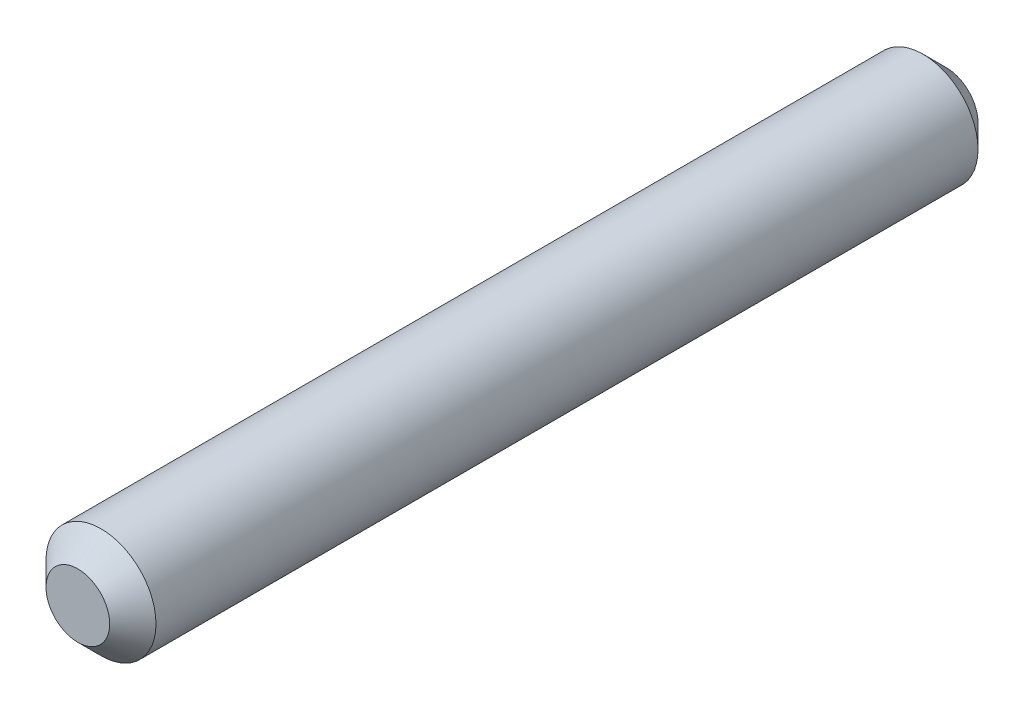
ISO-10303-21;
HEADER;
FILE_DESCRIPTION(('STEP AP214'),'2;1');
FILE_NAME('part.step','',(''),(''),'','','');
FILE_SCHEMA(('AUTOMOTIVE_DESIGN { 1 0 10303 214 1 1 1 1 }'));
ENDSEC;
DATA;
#1=APPLICATION_CONTEXT('core data for automotive mechanical design processes');
#2=APPLICATION_PROTOCOL_DEFINITION('international standard','automotive_design',2000,#1);
#3=PRODUCT_CONTEXT('',#1,'mechanical');
#4=PRODUCT('Part','Part','',(#3));
#5=PRODUCT_RELATED_PRODUCT_CATEGORY('part','',(#4));
#6=PRODUCT_DEFINITION_FORMATION('','',#4);
#7=PRODUCT_DEFINITION_CONTEXT('part definition',#1,'design');
#8=PRODUCT_DEFINITION('design','',#6,#7);
#9=PRODUCT_DEFINITION_SHAPE('','',#8);
#10=(LENGTH_UNIT() NAMED_UNIT(*) SI_UNIT(.MILLI.,.METRE.));
#11=(NAMED_UNIT(*) PLANE_ANGLE_UNIT() SI_UNIT($,.RADIAN.));
#12=(NAMED_UNIT(*) SI_UNIT($,.STERADIAN.) SOLID_ANGLE_UNIT());
#13=UNCERTAINTY_MEASURE_WITH_UNIT(LENGTH_MEASURE(1.E-05),#10,'distance_accuracy_value','');
#14=(GEOMETRIC_REPRESENTATION_CONTEXT(3) GLOBAL_UNCERTAINTY_ASSIGNED_CONTEXT((#13)) GLOBAL_UNIT_ASSIGNED_CONTEXT((#10,
#11,#12)) REPRESENTATION_CONTEXT('',''));
#15=CARTESIAN_POINT('',(0.,0.,0.));
#16=DIRECTION('',(0.,0.,1.));
#17=DIRECTION('',(1.,0.,0.));
#18=AXIS2_PLACEMENT_3D('',#15,#16,#17);
#19=CARTESIAN_POINT('',(0.,0.,75.));
#20=DIRECTION('',(0.,0.,-1.));
#21=DIRECTION('',(-1.,0.,0.));
#22=AXIS2_PLACEMENT_3D('',#19,#20,#21);
#23=CYLINDRICAL_SURFACE('',#22,4.75);
#24=CARTESIAN_POINT('',(0.,0.,73.));
#25=DIRECTION('',(0.,0.,1.));
#26=DIRECTION('',(1.,0.,0.));
#27=AXIS2_PLACEMENT_3D('',#24,#25,#26);
#28=CIRCLE('',#27,4.75);
#29=CARTESIAN_POINT('',(4.75,0.,73.));
#30=VERTEX_POINT('',#29);
#31=EDGE_CURVE('E41',#30,#30,#28,.F.);
#32=ORIENTED_EDGE('',*,*,#31,.T.);
#33=EDGE_LOOP('',(#32));
#34=FACE_BOUND('',#33,.T.);
#35=CARTESIAN_POINT('',(0.,0.,1.99999999999996));
#36=DIRECTION('',(0.,0.,1.));
#37=DIRECTION('',(1.,0.,0.));
#38=AXIS2_PLACEMENT_3D('',#35,#36,#37);
#39=CIRCLE('',#38,4.75);
#40=CARTESIAN_POINT('',(4.75,0.,1.99999999999996));
#41=VERTEX_POINT('',#40);
#42=EDGE_CURVE('E45',#41,#41,#39,.T.);
#43=ORIENTED_EDGE('',*,*,#42,.T.);
#44=EDGE_LOOP('',(#43));
#45=FACE_BOUND('',#44,.T.);
#46=ADVANCED_FACE('F33',(#34,#45),#23,.T.);
#47=CARTESIAN_POINT('',(0.,0.,75.));
#48=DIRECTION('',(0.,0.,1.));
#49=DIRECTION('',(1.,0.,0.));
#50=AXIS2_PLACEMENT_3D('',#47,#48,#49);
#51=PLANE('',#50);
#52=CARTESIAN_POINT('',(0.,0.,75.));
#53=DIRECTION('',(0.,0.,1.));
#54=DIRECTION('',(1.,0.,0.));
#55=AXIS2_PLACEMENT_3D('',#52,#53,#54);
#56=CIRCLE('',#55,2.75);
#57=CARTESIAN_POINT('',(2.75,0.,75.));
#58=VERTEX_POINT('',#57);
#59=EDGE_CURVE('E49',#58,#58,#56,.T.);
#60=ORIENTED_EDGE('',*,*,#59,.T.);
#61=EDGE_LOOP('',(#60));
#62=FACE_BOUND('',#61,.T.);
#63=ADVANCED_FACE('F55',(#62),#51,.T.);
#64=CARTESIAN_POINT('',(0.,0.,0.));
#65=DIRECTION('',(0.,0.,1.));
#66=DIRECTION('',(1.,0.,0.));
#67=AXIS2_PLACEMENT_3D('',#64,#65,#66);
#68=PLANE('',#67);
#69=CARTESIAN_POINT('',(0.,0.,0.));
#70=DIRECTION('',(0.,0.,1.));
#71=DIRECTION('',(1.,0.,0.));
#72=AXIS2_PLACEMENT_3D('',#69,#70,#71);
#73=CIRCLE('',#72,2.75000000000002);
#74=CARTESIAN_POINT('',(2.75000000000002,0.,0.));
#75=VERTEX_POINT('',#74);
#76=EDGE_CURVE('E10',#75,#75,#73,.F.);
#77=ORIENTED_EDGE('',*,*,#76,.T.);
#78=EDGE_LOOP('',(#77));
#79=FACE_BOUND('',#78,.T.);
#80=ADVANCED_FACE('F59',(#79),#68,.F.);
#81=CARTESIAN_POINT('',(0.,0.,75.));
#82=DIRECTION('',(0.,0.,-1.));
#83=DIRECTION('',(-1.,0.,0.));
#84=AXIS2_PLACEMENT_3D('',#81,#82,#83);
#85=CONICAL_SURFACE('',#84,2.75,0.785398163397447);
#86=ORIENTED_EDGE('',*,*,#31,.F.);
#87=EDGE_LOOP('',(#86));
#88=FACE_BOUND('',#87,.T.);
#89=ORIENTED_EDGE('',*,*,#59,.F.);
#90=EDGE_LOOP('',(#89));
#91=FACE_BOUND('',#90,.T.);
#92=ADVANCED_FACE('F57',(#88,#91),#85,.T.);
#93=CARTESIAN_POINT('',(0.,0.,1.99999999999996));
#94=DIRECTION('',(0.,0.,1.));
#95=DIRECTION('',(1.,0.,0.));
#96=AXIS2_PLACEMENT_3D('',#93,#94,#95);
#97=CONICAL_SURFACE('',#96,4.75,0.785398163397452);
#98=ORIENTED_EDGE('',*,*,#76,.F.);
#99=EDGE_LOOP('',(#98));
#100=FACE_BOUND('',#99,.T.);
#101=ORIENTED_EDGE('',*,*,#42,.F.);
#102=EDGE_LOOP('',(#101));
#103=FACE_BOUND('',#102,.T.);
#104=ADVANCED_FACE('F36',(#100,#103),#97,.T.);
#105=CLOSED_SHELL('',(#46,#63,#80,#92,#104));
#106=MANIFOLD_SOLID_BREP('B2',#105);
#107=ADVANCED_BREP_SHAPE_REPRESENTATION('',(#18,#106),#14);
#108=SHAPE_DEFINITION_REPRESENTATION(#9,#107);
ENDSEC;
END-ISO-10303-21;
